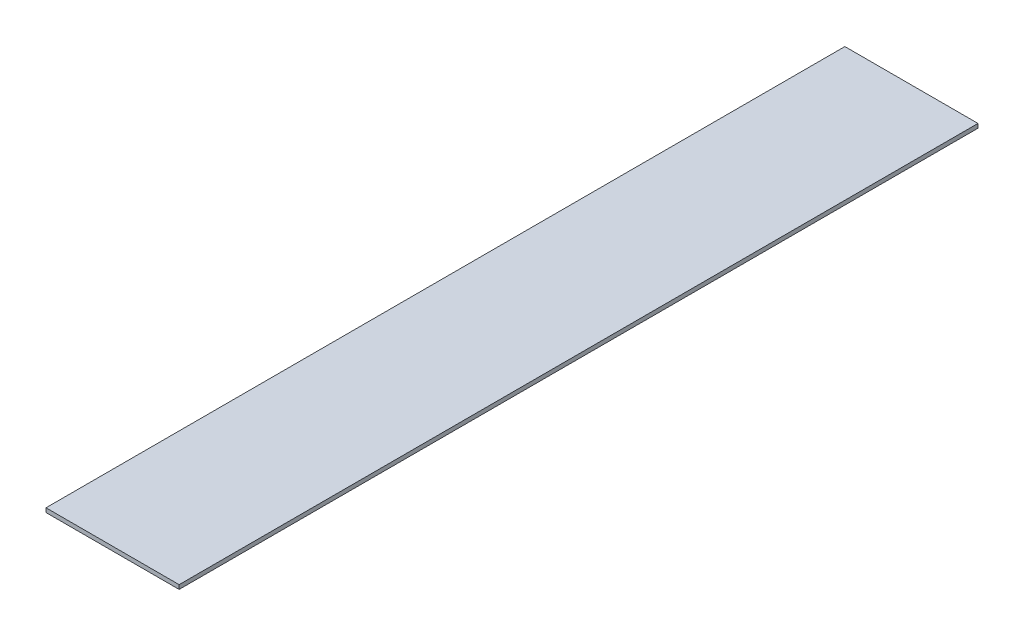
ISO-10303-21;
HEADER;
FILE_DESCRIPTION(('STEP AP214'),'2;1');
FILE_NAME('part.step','',(''),(''),'','','');
FILE_SCHEMA(('AUTOMOTIVE_DESIGN { 1 0 10303 214 1 1 1 1 }'));
ENDSEC;
DATA;
#1=APPLICATION_CONTEXT('core data for automotive mechanical design processes');
#2=APPLICATION_PROTOCOL_DEFINITION('international standard','automotive_design',2000,#1);
#3=PRODUCT_CONTEXT('',#1,'mechanical');
#4=PRODUCT('Part','Part','',(#3));
#5=PRODUCT_RELATED_PRODUCT_CATEGORY('part','',(#4));
#6=PRODUCT_DEFINITION_FORMATION('','',#4);
#7=PRODUCT_DEFINITION_CONTEXT('part definition',#1,'design');
#8=PRODUCT_DEFINITION('design','',#6,#7);
#9=PRODUCT_DEFINITION_SHAPE('','',#8);
#10=(LENGTH_UNIT() NAMED_UNIT(*) SI_UNIT(.MILLI.,.METRE.));
#11=(NAMED_UNIT(*) PLANE_ANGLE_UNIT() SI_UNIT($,.RADIAN.));
#12=(NAMED_UNIT(*) SI_UNIT($,.STERADIAN.) SOLID_ANGLE_UNIT());
#13=UNCERTAINTY_MEASURE_WITH_UNIT(LENGTH_MEASURE(1.E-05),#10,'distance_accuracy_value','');
#14=(GEOMETRIC_REPRESENTATION_CONTEXT(3) GLOBAL_UNCERTAINTY_ASSIGNED_CONTEXT((#13)) GLOBAL_UNIT_ASSIGNED_CONTEXT((#10,
#11,#12)) REPRESENTATION_CONTEXT('',''));
#15=CARTESIAN_POINT('',(0.,0.,0.));
#16=DIRECTION('',(0.,0.,1.));
#17=DIRECTION('',(1.,0.,0.));
#18=AXIS2_PLACEMENT_3D('',#15,#16,#17);
#19=CARTESIAN_POINT('',(-12.7,0.396875,76.2));
#20=DIRECTION('',(1.,0.,0.));
#21=DIRECTION('',(0.,0.,-1.));
#22=AXIS2_PLACEMENT_3D('',#19,#20,#21);
#23=PLANE('',#22);
#24=DIRECTION('',(0.,0.,-1.));
#25=VECTOR('',#24,1.);
#26=CARTESIAN_POINT('',(-12.7,0.396875,76.2));
#27=LINE('',#26,#25);
#28=CARTESIAN_POINT('',(-12.7,0.396875,76.2));
#29=VERTEX_POINT('',#28);
#30=CARTESIAN_POINT('',(-12.7,0.396875,-76.2));
#31=VERTEX_POINT('',#30);
#32=EDGE_CURVE('E89',#29,#31,#27,.T.);
#33=ORIENTED_EDGE('',*,*,#32,.T.);
#34=DIRECTION('',(0.,-1.,0.));
#35=VECTOR('',#34,1.);
#36=CARTESIAN_POINT('',(-12.7,0.396875,-76.2));
#37=LINE('',#36,#35);
#38=CARTESIAN_POINT('',(-12.7,-0.396875,-76.2));
#39=VERTEX_POINT('',#38);
#40=EDGE_CURVE('E84',#31,#39,#37,.T.);
#41=ORIENTED_EDGE('',*,*,#40,.T.);
#42=DIRECTION('',(0.,0.,-1.));
#43=VECTOR('',#42,1.);
#44=CARTESIAN_POINT('',(-12.7,-0.396875,76.2));
#45=LINE('',#44,#43);
#46=CARTESIAN_POINT('',(-12.7,-0.396875,76.2));
#47=VERTEX_POINT('',#46);
#48=EDGE_CURVE('E11',#47,#39,#45,.T.);
#49=ORIENTED_EDGE('',*,*,#48,.F.);
#50=DIRECTION('',(0.,-1.,0.));
#51=VECTOR('',#50,1.);
#52=CARTESIAN_POINT('',(-12.7,0.396875,76.2));
#53=LINE('',#52,#51);
#54=EDGE_CURVE('E95',#29,#47,#53,.T.);
#55=ORIENTED_EDGE('',*,*,#54,.F.);
#56=EDGE_LOOP('',(#33,#41,#49,#55));
#57=FACE_BOUND('',#56,.T.);
#58=ADVANCED_FACE('F32',(#57),#23,.F.);
#59=CARTESIAN_POINT('',(12.7,-0.396875,76.2));
#60=DIRECTION('',(0.,1.,0.));
#61=DIRECTION('',(0.,0.,1.));
#62=AXIS2_PLACEMENT_3D('',#59,#60,#61);
#63=PLANE('',#62);
#64=ORIENTED_EDGE('',*,*,#48,.T.);
#65=DIRECTION('',(1.,0.,0.));
#66=VECTOR('',#65,1.);
#67=CARTESIAN_POINT('',(12.7,-0.396875,-76.2));
#68=LINE('',#67,#66);
#69=CARTESIAN_POINT('',(12.7,-0.396875,-76.2));
#70=VERTEX_POINT('',#69);
#71=EDGE_CURVE('E74',#39,#70,#68,.T.);
#72=ORIENTED_EDGE('',*,*,#71,.T.);
#73=DIRECTION('',(0.,0.,-1.));
#74=VECTOR('',#73,1.);
#75=CARTESIAN_POINT('',(12.7,-0.396875,76.2));
#76=LINE('',#75,#74);
#77=CARTESIAN_POINT('',(12.7,-0.396875,76.2));
#78=VERTEX_POINT('',#77);
#79=EDGE_CURVE('E39',#78,#70,#76,.T.);
#80=ORIENTED_EDGE('',*,*,#79,.F.);
#81=DIRECTION('',(1.,0.,0.));
#82=VECTOR('',#81,1.);
#83=CARTESIAN_POINT('',(12.7,-0.396875,76.2));
#84=LINE('',#83,#82);
#85=EDGE_CURVE('E75',#47,#78,#84,.T.);
#86=ORIENTED_EDGE('',*,*,#85,.F.);
#87=EDGE_LOOP('',(#64,#72,#80,#86));
#88=FACE_BOUND('',#87,.T.);
#89=ADVANCED_FACE('F72',(#88),#63,.F.);
#90=CARTESIAN_POINT('',(12.7,0.396875,76.2));
#91=DIRECTION('',(-1.,0.,0.));
#92=DIRECTION('',(0.,0.,1.));
#93=AXIS2_PLACEMENT_3D('',#90,#91,#92);
#94=PLANE('',#93);
#95=ORIENTED_EDGE('',*,*,#79,.T.);
#96=DIRECTION('',(0.,1.,0.));
#97=VECTOR('',#96,1.);
#98=CARTESIAN_POINT('',(12.7,0.396875,-76.2));
#99=LINE('',#98,#97);
#100=CARTESIAN_POINT('',(12.7,0.396875,-76.2));
#101=VERTEX_POINT('',#100);
#102=EDGE_CURVE('E87',#70,#101,#99,.T.);
#103=ORIENTED_EDGE('',*,*,#102,.T.);
#104=DIRECTION('',(0.,0.,-1.));
#105=VECTOR('',#104,1.);
#106=CARTESIAN_POINT('',(12.7,0.396875,76.2));
#107=LINE('',#106,#105);
#108=CARTESIAN_POINT('',(12.7,0.396875,76.2));
#109=VERTEX_POINT('',#108);
#110=EDGE_CURVE('E101',#109,#101,#107,.T.);
#111=ORIENTED_EDGE('',*,*,#110,.F.);
#112=DIRECTION('',(0.,1.,0.));
#113=VECTOR('',#112,1.);
#114=CARTESIAN_POINT('',(12.7,0.396875,76.2));
#115=LINE('',#114,#113);
#116=EDGE_CURVE('E51',#78,#109,#115,.T.);
#117=ORIENTED_EDGE('',*,*,#116,.F.);
#118=EDGE_LOOP('',(#95,#103,#111,#117));
#119=FACE_BOUND('',#118,.T.);
#120=ADVANCED_FACE('F103',(#119),#94,.F.);
#121=CARTESIAN_POINT('',(12.7,0.396875,76.2));
#122=DIRECTION('',(0.,-1.,0.));
#123=DIRECTION('',(0.,0.,-1.));
#124=AXIS2_PLACEMENT_3D('',#121,#122,#123);
#125=PLANE('',#124);
#126=ORIENTED_EDGE('',*,*,#110,.T.);
#127=DIRECTION('',(-1.,0.,0.));
#128=VECTOR('',#127,1.);
#129=CARTESIAN_POINT('',(12.7,0.396875,-76.2));
#130=LINE('',#129,#128);
#131=EDGE_CURVE('E93',#101,#31,#130,.T.);
#132=ORIENTED_EDGE('',*,*,#131,.T.);
#133=ORIENTED_EDGE('',*,*,#32,.F.);
#134=DIRECTION('',(-1.,0.,0.));
#135=VECTOR('',#134,1.);
#136=CARTESIAN_POINT('',(12.7,0.396875,76.2));
#137=LINE('',#136,#135);
#138=EDGE_CURVE('E46',#109,#29,#137,.T.);
#139=ORIENTED_EDGE('',*,*,#138,.F.);
#140=EDGE_LOOP('',(#126,#132,#133,#139));
#141=FACE_BOUND('',#140,.T.);
#142=ADVANCED_FACE('F105',(#141),#125,.F.);
#143=CARTESIAN_POINT('',(0.,0.,76.2));
#144=DIRECTION('',(0.,0.,-1.));
#145=DIRECTION('',(-1.,0.,0.));
#146=AXIS2_PLACEMENT_3D('',#143,#144,#145);
#147=PLANE('',#146);
#148=ORIENTED_EDGE('',*,*,#54,.T.);
#149=ORIENTED_EDGE('',*,*,#85,.T.);
#150=ORIENTED_EDGE('',*,*,#116,.T.);
#151=ORIENTED_EDGE('',*,*,#138,.T.);
#152=EDGE_LOOP('',(#148,#149,#150,#151));
#153=FACE_BOUND('',#152,.T.);
#154=ADVANCED_FACE('F106',(#153),#147,.F.);
#155=CARTESIAN_POINT('',(0.,0.,-76.2));
#156=DIRECTION('',(0.,0.,-1.));
#157=DIRECTION('',(-1.,0.,0.));
#158=AXIS2_PLACEMENT_3D('',#155,#156,#157);
#159=PLANE('',#158);
#160=ORIENTED_EDGE('',*,*,#40,.F.);
#161=ORIENTED_EDGE('',*,*,#131,.F.);
#162=ORIENTED_EDGE('',*,*,#102,.F.);
#163=ORIENTED_EDGE('',*,*,#71,.F.);
#164=EDGE_LOOP('',(#160,#161,#162,#163));
#165=FACE_BOUND('',#164,.T.);
#166=ADVANCED_FACE('F82',(#165),#159,.T.);
#167=CLOSED_SHELL('',(#58,#89,#120,#142,#154,#166));
#168=MANIFOLD_SOLID_BREP('B2',#167);
#169=ADVANCED_BREP_SHAPE_REPRESENTATION('',(#18,#168),#14);
#170=SHAPE_DEFINITION_REPRESENTATION(#9,#169);
ENDSEC;
END-ISO-10303-21;
